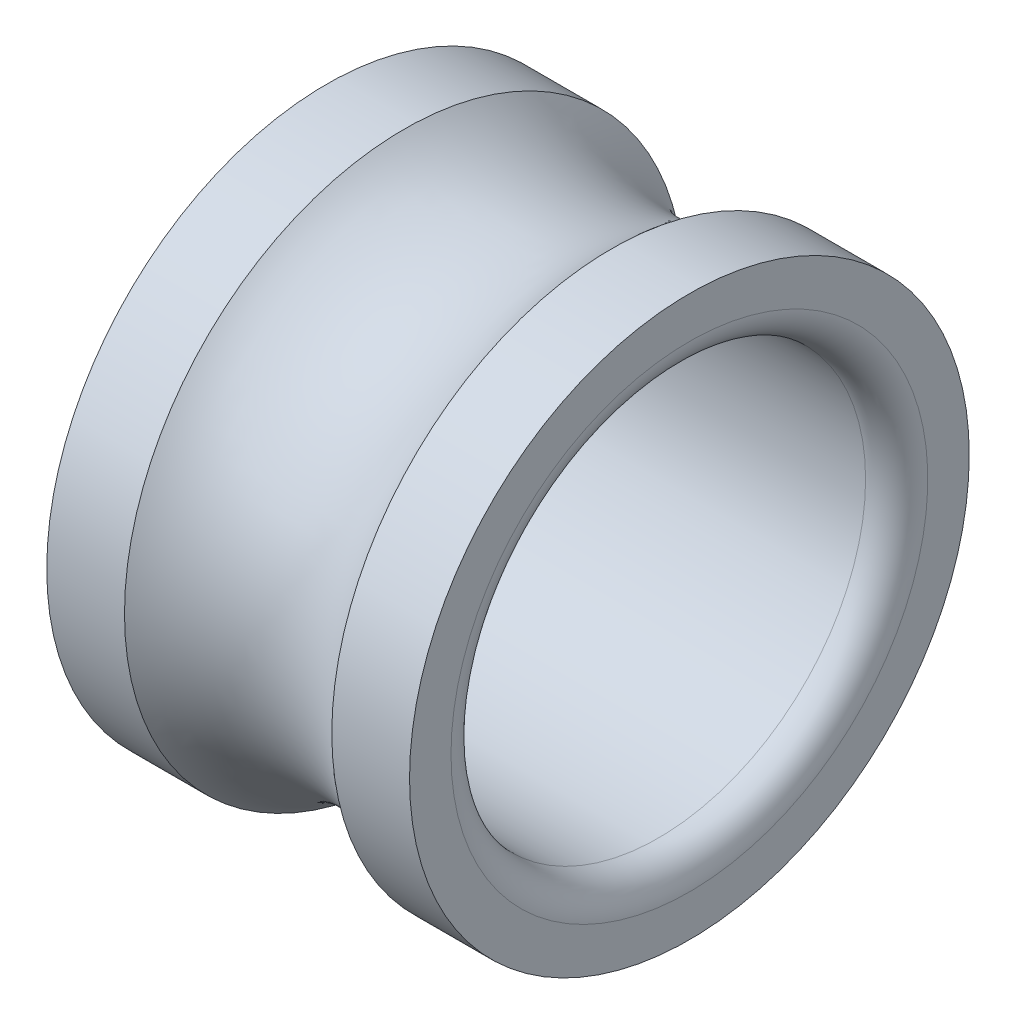
ISO-10303-21;
HEADER;
FILE_DESCRIPTION(('STEP AP214'),'2;1');
FILE_NAME('part.step','',(''),(''),'','','');
FILE_SCHEMA(('AUTOMOTIVE_DESIGN { 1 0 10303 214 1 1 1 1 }'));
ENDSEC;
DATA;
#1=APPLICATION_CONTEXT('core data for automotive mechanical design processes');
#2=APPLICATION_PROTOCOL_DEFINITION('international standard','automotive_design',2000,#1);
#3=PRODUCT_CONTEXT('',#1,'mechanical');
#4=PRODUCT('Part','Part','',(#3));
#5=PRODUCT_RELATED_PRODUCT_CATEGORY('part','',(#4));
#6=PRODUCT_DEFINITION_FORMATION('','',#4);
#7=PRODUCT_DEFINITION_CONTEXT('part definition',#1,'design');
#8=PRODUCT_DEFINITION('design','',#6,#7);
#9=PRODUCT_DEFINITION_SHAPE('','',#8);
#10=(LENGTH_UNIT() NAMED_UNIT(*) SI_UNIT(.MILLI.,.METRE.));
#11=(NAMED_UNIT(*) PLANE_ANGLE_UNIT() SI_UNIT($,.RADIAN.));
#12=(NAMED_UNIT(*) SI_UNIT($,.STERADIAN.) SOLID_ANGLE_UNIT());
#13=UNCERTAINTY_MEASURE_WITH_UNIT(LENGTH_MEASURE(1.E-05),#10,'distance_accuracy_value','');
#14=(GEOMETRIC_REPRESENTATION_CONTEXT(3) GLOBAL_UNCERTAINTY_ASSIGNED_CONTEXT((#13)) GLOBAL_UNIT_ASSIGNED_CONTEXT((#10,
#11,#12)) REPRESENTATION_CONTEXT('',''));
#15=CARTESIAN_POINT('',(0.,0.,0.));
#16=DIRECTION('',(0.,0.,1.));
#17=DIRECTION('',(1.,0.,0.));
#18=AXIS2_PLACEMENT_3D('',#15,#16,#17);
#19=CARTESIAN_POINT('',(-20.1486875669047,0.,0.));
#20=DIRECTION('',(-1.,0.,0.));
#21=DIRECTION('',(0.,0.,1.));
#22=AXIS2_PLACEMENT_3D('',#19,#20,#21);
#23=CYLINDRICAL_SURFACE('',#22,5.4);
#24=CARTESIAN_POINT('',(2.00000000000001,0.,0.));
#25=DIRECTION('',(-1.,0.,0.));
#26=DIRECTION('',(0.,0.,1.));
#27=AXIS2_PLACEMENT_3D('',#24,#25,#26);
#28=CIRCLE('',#27,5.4);
#29=CARTESIAN_POINT('',(2.00000000000001,0.,5.4));
#30=VERTEX_POINT('',#29);
#31=EDGE_CURVE('E61',#30,#30,#28,.T.);
#32=ORIENTED_EDGE('',*,*,#31,.F.);
#33=EDGE_LOOP('',(#32));
#34=FACE_BOUND('',#33,.T.);
#35=CARTESIAN_POINT('',(3.50000000000001,0.,0.));
#36=DIRECTION('',(-1.,0.,0.));
#37=DIRECTION('',(0.,0.,1.));
#38=AXIS2_PLACEMENT_3D('',#35,#36,#37);
#39=CIRCLE('',#38,5.4);
#40=CARTESIAN_POINT('',(3.50000000000001,0.,5.4));
#41=VERTEX_POINT('',#40);
#42=EDGE_CURVE('E10',#41,#41,#39,.T.);
#43=ORIENTED_EDGE('',*,*,#42,.T.);
#44=EDGE_LOOP('',(#43));
#45=FACE_BOUND('',#44,.T.);
#46=ADVANCED_FACE('F33',(#34,#45),#23,.T.);
#47=CARTESIAN_POINT('',(3.5,5.4,0.));
#48=DIRECTION('',(-1.,0.,0.));
#49=DIRECTION('',(0.,0.,1.));
#50=AXIS2_PLACEMENT_3D('',#47,#48,#49);
#51=PLANE('',#50);
#52=ORIENTED_EDGE('',*,*,#42,.F.);
#53=EDGE_LOOP('',(#52));
#54=FACE_BOUND('',#53,.T.);
#55=CARTESIAN_POINT('',(3.5,0.,0.));
#56=DIRECTION('',(-1.,0.,0.));
#57=DIRECTION('',(0.,0.,1.));
#58=AXIS2_PLACEMENT_3D('',#55,#56,#57);
#59=CIRCLE('',#58,4.6);
#60=CARTESIAN_POINT('',(3.5,0.,4.6));
#61=VERTEX_POINT('',#60);
#62=EDGE_CURVE('E39',#61,#61,#59,.T.);
#63=ORIENTED_EDGE('',*,*,#62,.T.);
#64=EDGE_LOOP('',(#63));
#65=FACE_BOUND('',#64,.T.);
#66=ADVANCED_FACE('F68',(#54,#65),#51,.F.);
#67=CARTESIAN_POINT('',(2.9,0.,0.));
#68=DIRECTION('',(-1.,0.,0.));
#69=DIRECTION('',(0.,0.,1.));
#70=AXIS2_PLACEMENT_3D('',#67,#68,#69);
#71=TOROIDAL_SURFACE('',#70,4.6,0.6);
#72=ORIENTED_EDGE('',*,*,#62,.F.);
#73=EDGE_LOOP('',(#72));
#74=FACE_BOUND('',#73,.T.);
#75=CARTESIAN_POINT('',(2.9,0.,0.));
#76=DIRECTION('',(-1.,0.,0.));
#77=DIRECTION('',(0.,0.,1.));
#78=AXIS2_PLACEMENT_3D('',#75,#76,#77);
#79=CIRCLE('',#78,4.);
#80=CARTESIAN_POINT('',(2.9,0.,4.));
#81=VERTEX_POINT('',#80);
#82=EDGE_CURVE('E43',#81,#81,#79,.T.);
#83=ORIENTED_EDGE('',*,*,#82,.T.);
#84=EDGE_LOOP('',(#83));
#85=FACE_BOUND('',#84,.T.);
#86=ADVANCED_FACE('F72',(#74,#85),#71,.T.);
#87=CARTESIAN_POINT('',(-20.1486875669047,0.,0.));
#88=DIRECTION('',(-1.,0.,0.));
#89=DIRECTION('',(0.,0.,1.));
#90=AXIS2_PLACEMENT_3D('',#87,#88,#89);
#91=CYLINDRICAL_SURFACE('',#90,4.);
#92=ORIENTED_EDGE('',*,*,#82,.F.);
#93=EDGE_LOOP('',(#92));
#94=FACE_BOUND('',#93,.T.);
#95=CARTESIAN_POINT('',(-2.90000000000001,0.,0.));
#96=DIRECTION('',(-1.,0.,0.));
#97=DIRECTION('',(0.,0.,1.));
#98=AXIS2_PLACEMENT_3D('',#95,#96,#97);
#99=CIRCLE('',#98,4.);
#100=CARTESIAN_POINT('',(-2.90000000000001,0.,4.));
#101=VERTEX_POINT('',#100);
#102=EDGE_CURVE('E47',#101,#101,#99,.T.);
#103=ORIENTED_EDGE('',*,*,#102,.T.);
#104=EDGE_LOOP('',(#103));
#105=FACE_BOUND('',#104,.T.);
#106=ADVANCED_FACE('F77',(#94,#105),#91,.F.);
#107=CARTESIAN_POINT('',(-2.90000000000001,0.,0.));
#108=DIRECTION('',(-1.,0.,0.));
#109=DIRECTION('',(0.,0.,1.));
#110=AXIS2_PLACEMENT_3D('',#107,#108,#109);
#111=TOROIDAL_SURFACE('',#110,4.6,0.599999999999999);
#112=ORIENTED_EDGE('',*,*,#102,.F.);
#113=EDGE_LOOP('',(#112));
#114=FACE_BOUND('',#113,.T.);
#115=CARTESIAN_POINT('',(-3.50000000000001,0.,0.));
#116=DIRECTION('',(-1.,0.,0.));
#117=DIRECTION('',(0.,0.,1.));
#118=AXIS2_PLACEMENT_3D('',#115,#116,#117);
#119=CIRCLE('',#118,4.6);
#120=CARTESIAN_POINT('',(-3.50000000000001,0.,4.6));
#121=VERTEX_POINT('',#120);
#122=EDGE_CURVE('E52',#121,#121,#119,.T.);
#123=ORIENTED_EDGE('',*,*,#122,.T.);
#124=EDGE_LOOP('',(#123));
#125=FACE_BOUND('',#124,.T.);
#126=ADVANCED_FACE('F83',(#114,#125),#111,.T.);
#127=CARTESIAN_POINT('',(-3.5,5.4,0.));
#128=DIRECTION('',(1.,0.,0.));
#129=DIRECTION('',(0.,0.,-1.));
#130=AXIS2_PLACEMENT_3D('',#127,#128,#129);
#131=PLANE('',#130);
#132=ORIENTED_EDGE('',*,*,#122,.F.);
#133=EDGE_LOOP('',(#132));
#134=FACE_BOUND('',#133,.T.);
#135=CARTESIAN_POINT('',(-3.5,0.,0.));
#136=DIRECTION('',(-1.,0.,0.));
#137=DIRECTION('',(0.,0.,1.));
#138=AXIS2_PLACEMENT_3D('',#135,#136,#137);
#139=CIRCLE('',#138,5.4);
#140=CARTESIAN_POINT('',(-3.5,0.,5.4));
#141=VERTEX_POINT('',#140);
#142=EDGE_CURVE('E55',#141,#141,#139,.T.);
#143=ORIENTED_EDGE('',*,*,#142,.T.);
#144=EDGE_LOOP('',(#143));
#145=FACE_BOUND('',#144,.T.);
#146=ADVANCED_FACE('F87',(#134,#145),#131,.F.);
#147=CARTESIAN_POINT('',(-20.1486875669047,0.,0.));
#148=DIRECTION('',(-1.,0.,0.));
#149=DIRECTION('',(0.,0.,1.));
#150=AXIS2_PLACEMENT_3D('',#147,#148,#149);
#151=CYLINDRICAL_SURFACE('',#150,5.4);
#152=ORIENTED_EDGE('',*,*,#142,.F.);
#153=EDGE_LOOP('',(#152));
#154=FACE_BOUND('',#153,.T.);
#155=CARTESIAN_POINT('',(-1.99999999999999,0.,0.));
#156=DIRECTION('',(-1.,0.,0.));
#157=DIRECTION('',(0.,0.,1.));
#158=AXIS2_PLACEMENT_3D('',#155,#156,#157);
#159=CIRCLE('',#158,5.4);
#160=CARTESIAN_POINT('',(-1.99999999999999,0.,5.4));
#161=VERTEX_POINT('',#160);
#162=EDGE_CURVE('E58',#161,#161,#159,.T.);
#163=ORIENTED_EDGE('',*,*,#162,.T.);
#164=EDGE_LOOP('',(#163));
#165=FACE_BOUND('',#164,.T.);
#166=ADVANCED_FACE('F91',(#154,#165),#151,.T.);
#167=CARTESIAN_POINT('',(0.,0.,0.));
#168=DIRECTION('',(-1.,0.,0.));
#169=DIRECTION('',(0.,0.,1.));
#170=AXIS2_PLACEMENT_3D('',#167,#168,#169);
#171=TOROIDAL_SURFACE('',#170,7.63606797749979,3.);
#172=ORIENTED_EDGE('',*,*,#162,.F.);
#173=EDGE_LOOP('',(#172));
#174=FACE_BOUND('',#173,.T.);
#175=ORIENTED_EDGE('',*,*,#31,.T.);
#176=EDGE_LOOP('',(#175));
#177=FACE_BOUND('',#176,.T.);
#178=ADVANCED_FACE('F65',(#174,#177),#171,.F.);
#179=CLOSED_SHELL('',(#46,#66,#86,#106,#126,#146,#166,#178));
#180=MANIFOLD_SOLID_BREP('B2',#179);
#181=ADVANCED_BREP_SHAPE_REPRESENTATION('',(#18,#180),#14);
#182=SHAPE_DEFINITION_REPRESENTATION(#9,#181);
ENDSEC;
END-ISO-10303-21;
